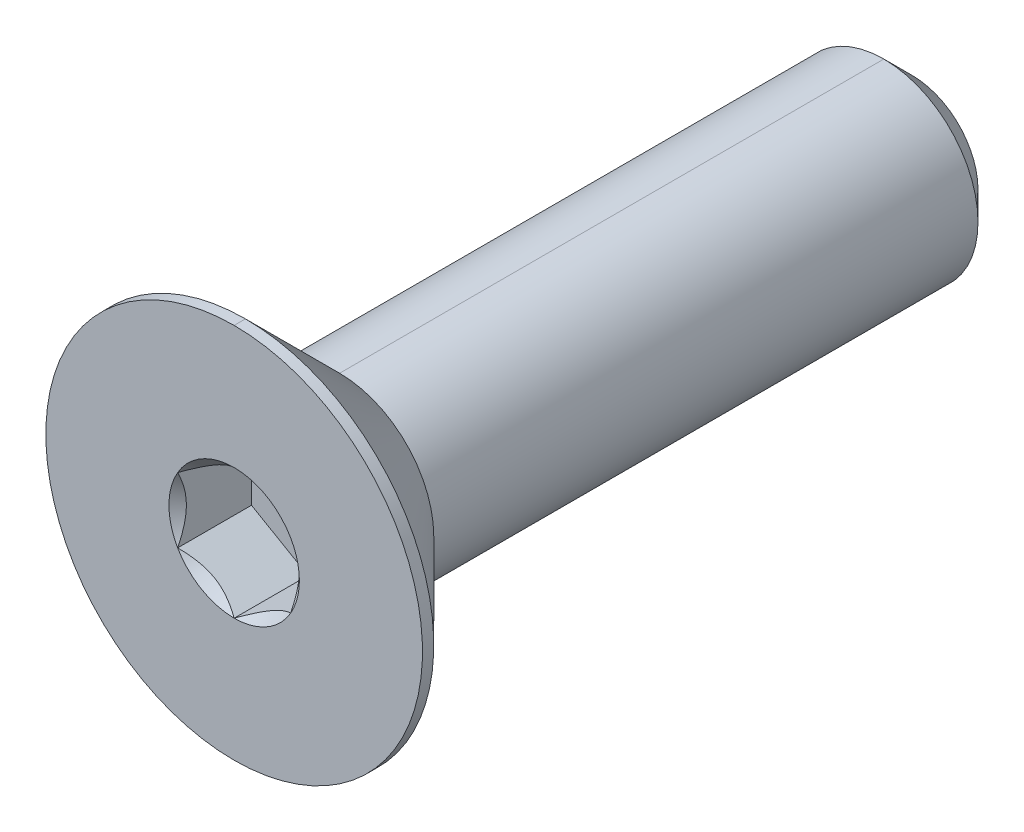
ISO-10303-21;
HEADER;
FILE_DESCRIPTION(('STEP AP214'),'2;1');
FILE_NAME('part.step','',(''),(''),'','','');
FILE_SCHEMA(('AUTOMOTIVE_DESIGN { 1 0 10303 214 1 1 1 1 }'));
ENDSEC;
DATA;
#1=APPLICATION_CONTEXT('core data for automotive mechanical design processes');
#2=APPLICATION_PROTOCOL_DEFINITION('international standard','automotive_design',2000,#1);
#3=PRODUCT_CONTEXT('',#1,'mechanical');
#4=PRODUCT('Part','Part','',(#3));
#5=PRODUCT_RELATED_PRODUCT_CATEGORY('part','',(#4));
#6=PRODUCT_DEFINITION_FORMATION('','',#4);
#7=PRODUCT_DEFINITION_CONTEXT('part definition',#1,'design');
#8=PRODUCT_DEFINITION('design','',#6,#7);
#9=PRODUCT_DEFINITION_SHAPE('','',#8);
#10=(LENGTH_UNIT() NAMED_UNIT(*) SI_UNIT(.MILLI.,.METRE.));
#11=(NAMED_UNIT(*) PLANE_ANGLE_UNIT() SI_UNIT($,.RADIAN.));
#12=(NAMED_UNIT(*) SI_UNIT($,.STERADIAN.) SOLID_ANGLE_UNIT());
#13=UNCERTAINTY_MEASURE_WITH_UNIT(LENGTH_MEASURE(1.E-05),#10,'distance_accuracy_value','');
#14=(GEOMETRIC_REPRESENTATION_CONTEXT(3) GLOBAL_UNCERTAINTY_ASSIGNED_CONTEXT((#13)) GLOBAL_UNIT_ASSIGNED_CONTEXT((#10,
#11,#12)) REPRESENTATION_CONTEXT('',''));
#15=CARTESIAN_POINT('',(0.,0.,0.));
#16=DIRECTION('',(0.,0.,1.));
#17=DIRECTION('',(1.,0.,0.));
#18=AXIS2_PLACEMENT_3D('',#15,#16,#17);
#19=CARTESIAN_POINT('',(0.,0.,9.));
#20=DIRECTION('',(0.,0.,1.));
#21=DIRECTION('',(1.,0.,0.));
#22=AXIS2_PLACEMENT_3D('',#19,#20,#21);
#23=CONICAL_SURFACE('',#22,1.73205080756887,0.78539816339745);
#24=CARTESIAN_POINT('',(0.,1.73205080756888,9.));
#25=CARTESIAN_POINT('',(0.0304755061116495,1.71445405344315,8.98240817434612));
#26=CARTESIAN_POINT('',(0.0612309553783832,1.69668979031318,8.96544336172686));
#27=CARTESIAN_POINT('',(0.122223404849649,1.66146148560235,8.9336134328772));
#28=CARTESIAN_POINT('',(0.152439557180836,1.64400945824889,8.91869489506414));
#29=CARTESIAN_POINT('',(0.212498448213601,1.60933272806347,8.89094966665708));
#30=CARTESIAN_POINT('',(0.242323290897872,1.59211799695153,8.87807213097908));
#31=CARTESIAN_POINT('',(0.301755621301267,1.55782439278804,8.85441165270532));
#32=CARTESIAN_POINT('',(0.331349516352911,1.54075310216759,8.84358395838557));
#33=CARTESIAN_POINT('',(0.377432377824598,1.51413628951098,8.82831451163822));
#34=CARTESIAN_POINT('',(0.393764037702862,1.50469688764808,8.82320709787128));
#35=CARTESIAN_POINT('',(0.426275986645927,1.48589492401473,8.81367579608939));
#36=CARTESIAN_POINT('',(0.442454106519574,1.47653379763414,8.80924173567327));
#37=CARTESIAN_POINT('',(0.474702535138814,1.45787786495759,8.80105871198228));
#38=CARTESIAN_POINT('',(0.490771147191658,1.4485839848936,8.79730096963769));
#39=CARTESIAN_POINT('',(0.522841661720542,1.4300450175165,8.79046828735147));
#40=CARTESIAN_POINT('',(0.538842403074621,1.4208004912597,8.7873863957173));
#41=CARTESIAN_POINT('',(0.570818086297726,1.40233941442039,8.78190370645799));
#42=CARTESIAN_POINT('',(0.586792369672559,1.39312314924559,8.7794981190257));
#43=CARTESIAN_POINT('',(0.618754808071478,1.37469319456542,8.77536553669029));
#44=CARTESIAN_POINT('',(0.634742719251687,1.36547960875135,8.77363619824576));
#45=CARTESIAN_POINT('',(0.66677130632234,1.34702613950009,8.77085424819795));
#46=CARTESIAN_POINT('',(0.682812001750678,1.33778624655028,8.76980192452819));
#47=CARTESIAN_POINT('',(0.714981879056066,1.31924441598487,8.76836887771224));
#48=CARTESIAN_POINT('',(0.731111139208447,1.30994238444656,8.76799113664691));
#49=CARTESIAN_POINT('',(0.763265778927167,1.29138030742534,8.76791426620296));
#50=CARTESIAN_POINT('',(0.779291197474868,1.28212034772763,8.76821105152241));
#51=CARTESIAN_POINT('',(0.811279823381253,1.26364230939171,8.76949073732336));
#52=CARTESIAN_POINT('',(0.827243080276223,1.25442418573263,8.77047173947734));
#53=CARTESIAN_POINT('',(0.859152662699485,1.23600879051723,8.77311462962399));
#54=CARTESIAN_POINT('',(0.875098939820273,1.22681156120121,8.77477739434542));
#55=CARTESIAN_POINT('',(0.907018811581781,1.20841577607493,8.77878164980129));
#56=CARTESIAN_POINT('',(0.922992105001491,1.19921747027645,8.78112668207258));
#57=CARTESIAN_POINT('',(0.955007121517731,1.1807933347439,8.78649274846579));
#58=CARTESIAN_POINT('',(0.971048136325059,1.17156802144486,8.78951976345473));
#59=CARTESIAN_POINT('',(1.00323676403784,1.1530604253202,8.79624718072961));
#60=CARTESIAN_POINT('',(1.01938312421892,1.1437789182885,8.79995568486288));
#61=CARTESIAN_POINT('',(1.05181812480565,1.12512812234856,8.80804518640825));
#62=CARTESIAN_POINT('',(1.0681048691028,1.11575982686234,8.81243605190959));
#63=CARTESIAN_POINT('',(1.10085090156266,1.09689691475906,8.82188432956243));
#64=CARTESIAN_POINT('',(1.11730753786702,1.0874033060841,8.82695287744186));
#65=CARTESIAN_POINT('',(1.16404791243579,1.06040232400226,8.84222055822837));
#66=CARTESIAN_POINT('',(1.19415102449094,1.04296750338085,8.85310787590376));
#67=CARTESIAN_POINT('',(1.2545390921125,1.00799282718252,8.87692903743632));
#68=CARTESIAN_POINT('',(1.28481141481348,0.990460294906088,8.8899053103512));
#69=CARTESIAN_POINT('',(1.3457152893563,0.955203838573414,8.91788528894892));
#70=CARTESIAN_POINT('',(1.37632989241537,0.937490235825286,8.93293854667534));
#71=CARTESIAN_POINT('',(1.4380724117721,0.901790289660898,8.9650740876172));
#72=CARTESIAN_POINT('',(1.46918010443147,0.883816506960307,8.9822093516128));
#73=CARTESIAN_POINT('',(1.5,0.866025403784444,9.));
#74=B_SPLINE_CURVE_WITH_KNOTS('',3,(#24,#25,#26,#27,#28,#29,#30,#31,#32,#33,#34,#35,#36,#37,#38,
#39,#40,#41,#42,#43,#44,#45,#46,#47,#48,#49,#50,#51,#52,#53,#54,#55,#56,#57,#58,#59,#60,#61,#62,
#63,#64,#65,#66,#67,#68,#69,#70,#71,#72,#73),.UNSPECIFIED.,.F.,.F.,(4,2,2,2,2,2,2,2,2,2,2,2,2,2,
2,2,2,2,2,2,2,2,2,2,4),(0.,0.118039663714003,0.231854143020199,0.342107623798448,
0.449571592121338,0.508191019061397,0.565810636617404,0.622617741886474,0.678809844962724,
0.7345933307162,0.790181748253832,0.845793791873537,0.901651072914145,0.957170953773542,
1.01253740691627,1.06797528429429,1.12370622740329,1.17994638524861,1.23690438230184,
1.29477963264379,1.35376105667037,1.46305838518519,1.57494903784592,1.69023306306883,
1.80960022802586),.UNSPECIFIED.);
#75=CARTESIAN_POINT('',(0.,1.73205080756888,9.));
#76=VERTEX_POINT('',#75);
#77=CARTESIAN_POINT('',(1.5,0.866025403784445,9.));
#78=VERTEX_POINT('',#77);
#79=EDGE_CURVE('E310',#76,#78,#74,.T.);
#80=ORIENTED_EDGE('',*,*,#79,.T.);
#81=CARTESIAN_POINT('',(0.,0.,9.));
#82=DIRECTION('',(0.,0.,1.));
#83=DIRECTION('',(1.,0.,0.));
#84=AXIS2_PLACEMENT_3D('',#81,#82,#83);
#85=CIRCLE('',#84,1.73205080756887);
#86=EDGE_CURVE('E155',#78,#76,#85,.T.);
#87=ORIENTED_EDGE('',*,*,#86,.T.);
#88=EDGE_LOOP('',(#80,#87));
#89=FACE_BOUND('',#88,.T.);
#90=ADVANCED_FACE('F16',(#89),#23,.F.);
#91=CARTESIAN_POINT('',(0.,0.,9.));
#92=DIRECTION('',(0.,0.,1.));
#93=DIRECTION('',(1.,0.,0.));
#94=AXIS2_PLACEMENT_3D('',#91,#92,#93);
#95=CONICAL_SURFACE('',#94,1.73205080756887,0.78539816339745);
#96=CARTESIAN_POINT('',(-1.5,-0.866025403784427,9.));
#97=CARTESIAN_POINT('',(-1.49999847155042,-0.830563239060232,8.98227267797866));
#98=CARTESIAN_POINT('',(-1.49999144846271,-0.794769818314377,8.96518162548565));
#99=CARTESIAN_POINT('',(-1.49997812287993,-0.723792778913651,8.93313385914066));
#100=CARTESIAN_POINT('',(-1.49997180352168,-0.688633814532978,8.91812235896397));
#101=CARTESIAN_POINT('',(-1.49996990419214,-0.618759366688804,8.89022557424516));
#102=CARTESIAN_POINT('',(-1.49997399200523,-0.584064833529213,8.87728818678176));
#103=CARTESIAN_POINT('',(-1.49999198314124,-0.514933499326287,8.85354250716544));
#104=CARTESIAN_POINT('',(-1.50000563443526,-0.480512547070614,8.84268847127564));
#105=CARTESIAN_POINT('',(-1.49999694849468,-0.427029905923123,8.82744296048106));
#106=CARTESIAN_POINT('',(-1.4999882402842,-0.408160726019241,8.82236987715932));
#107=CARTESIAN_POINT('',(-1.49996134676691,-0.370592501344601,8.81290812530967));
#108=CARTESIAN_POINT('',(-1.49994332551577,-0.351896038168047,8.80850926542317));
#109=CARTESIAN_POINT('',(-1.49991071272959,-0.314630066948124,8.80039761805684));
#110=CARTESIAN_POINT('',(-1.49989607649713,-0.296062475104422,8.79667604664695));
#111=CARTESIAN_POINT('',(-1.49987569653432,-0.259009711802849,8.78991664991825));
#112=CARTESIAN_POINT('',(-1.49986985863054,-0.240525810048958,8.78687188537265));
#113=CARTESIAN_POINT('',(-1.499869545084,-0.203594417631662,8.78146433876417));
#114=CARTESIAN_POINT('',(-1.49987498780784,-0.185147625618623,8.77909679704042));
#115=CARTESIAN_POINT('',(-1.49989529319158,-0.148243233932046,8.77504133972275));
#116=CARTESIAN_POINT('',(-1.49991012355422,-0.12978588723405,8.77335112627764));
#117=CARTESIAN_POINT('',(-1.49994307195869,-0.09281212113247,8.77064783334563));
#118=CARTESIAN_POINT('',(-1.49996119168192,-0.0742956762975891,8.76963510140946));
#119=CARTESIAN_POINT('',(-1.4999899206611,-0.037154751298292,8.76828391417117));
#120=CARTESIAN_POINT('',(-1.50000049569724,-0.0185301603598793,8.76794851858871));
#121=CARTESIAN_POINT('',(-1.49999950449802,0.0187116662846115,8.76794987195051));
#122=CARTESIAN_POINT('',(-1.49998794698299,0.037328901998005,8.76828635617338));
#123=CARTESIAN_POINT('',(-1.49995818834662,0.0744571248470478,8.76964016380417));
#124=CARTESIAN_POINT('',(-1.49994001652738,0.0929682203476789,8.77065450056816));
#125=CARTESIAN_POINT('',(-1.49990736654743,0.129933330312027,8.77336113981796));
#126=CARTESIAN_POINT('',(-1.49989288692022,0.148387364553618,8.77505317244332));
#127=CARTESIAN_POINT('',(-1.49987353578372,0.185287204915863,8.77911248103033));
#128=CARTESIAN_POINT('',(-1.49986869857504,0.203732749126027,8.78148213341868));
#129=CARTESIAN_POINT('',(-1.49987023406792,0.240663748003625,8.78689409840748));
#130=CARTESIAN_POINT('',(-1.49987668978362,0.259148492140854,8.78994124739667));
#131=CARTESIAN_POINT('',(-1.49989807315694,0.296205076049326,8.79670559870344));
#132=CARTESIAN_POINT('',(-1.49991309335925,0.314775632054697,8.80042981263665));
#133=CARTESIAN_POINT('',(-1.49994609817511,0.352049671943595,8.80854701036074));
#134=CARTESIAN_POINT('',(-1.49996412233174,0.370751223934245,8.81294884556339));
#135=CARTESIAN_POINT('',(-1.4999900870056,0.408331871722514,8.82241653008241));
#136=CARTESIAN_POINT('',(-1.4999978460813,0.427208371273022,8.82749262577144));
#137=CARTESIAN_POINT('',(-1.50000397313625,0.480677103164354,8.84273755024362));
#138=CARTESIAN_POINT('',(-1.49998887427707,0.515077173012235,8.85358664366741));
#139=CARTESIAN_POINT('',(-1.49996977091219,0.584170270459098,8.87732286491198));
#140=CARTESIAN_POINT('',(-1.4999660672554,0.618847383789014,8.89025591878164));
#141=CARTESIAN_POINT('',(-1.49996912635196,0.688690754940299,8.91814395738562));
#142=CARTESIAN_POINT('',(-1.49997623485142,0.723836005199007,8.93315117889313));
#143=CARTESIAN_POINT('',(-1.49999089575749,0.794789403575432,8.96519049529969));
#144=CARTESIAN_POINT('',(-1.49999845480796,0.830572848246732,8.98227748230005));
#145=CARTESIAN_POINT('',(-1.5,0.866025403784438,9.));
#146=B_SPLINE_CURVE_WITH_KNOTS('',3,(#96,#97,#98,#99,#100,#101,#102,#103,#104,#105,#106,#107,
#108,#109,#110,#111,#112,#113,#114,#115,#116,#117,#118,#119,#120,#121,#122,#123,#124,#125,#126,
#127,#128,#129,#130,#131,#132,#133,#134,#135,#136,#137,#138,#139,#140,#141,#142,#143,#144,#145),
.UNSPECIFIED.,.F.,.F.,(4,2,2,2,2,2,2,2,2,2,2,2,2,2,2,2,2,2,2,2,2,2,2,2,4),(0.,0.118949666093114,
0.23360393704888,0.344644433065874,0.452863640325714,0.511473149776386,0.569083728709154,
0.625883551472879,0.682070985391223,0.737853233369471,0.793444603350177,0.849064470101596,
0.904935030502023,0.960783582182657,1.01638767132517,1.07196964073668,1.12774897949595,
1.18394007632196,1.24075018233933,1.29837768404936,1.3570107513648,1.46516579795423,
1.57615279944772,1.69076424836394,1.8096816972802),.UNSPECIFIED.);
#147=CARTESIAN_POINT('',(-1.5,-0.866025403784429,9.));
#148=VERTEX_POINT('',#147);
#149=CARTESIAN_POINT('',(-1.5,0.866025403784437,9.));
#150=VERTEX_POINT('',#149);
#151=EDGE_CURVE('E199',#148,#150,#146,.T.);
#152=ORIENTED_EDGE('',*,*,#151,.T.);
#153=CARTESIAN_POINT('',(0.,0.,9.));
#154=DIRECTION('',(0.,0.,1.));
#155=DIRECTION('',(1.,0.,0.));
#156=AXIS2_PLACEMENT_3D('',#153,#154,#155);
#157=CIRCLE('',#156,1.73205080756887);
#158=EDGE_CURVE('E368',#150,#148,#157,.T.);
#159=ORIENTED_EDGE('',*,*,#158,.T.);
#160=EDGE_LOOP('',(#152,#159));
#161=FACE_BOUND('',#160,.T.);
#162=ADVANCED_FACE('F179',(#161),#95,.F.);
#163=CARTESIAN_POINT('',(0.,0.,9.));
#164=DIRECTION('',(0.,0.,1.));
#165=DIRECTION('',(1.,0.,0.));
#166=AXIS2_PLACEMENT_3D('',#163,#164,#165);
#167=CONICAL_SURFACE('',#166,1.73205080756887,0.78539816339745);
#168=CARTESIAN_POINT('',(1.49999999999999,-0.866025403784441,9.));
#169=CARTESIAN_POINT('',(1.46952301084714,-0.883619589207439,8.98240817434612));
#170=CARTESIAN_POINT('',(1.43876098306373,-0.901372458012252,8.96544336172688));
#171=CARTESIAN_POINT('',(1.37775615151627,-0.936579316337994,8.93361343287722));
#172=CARTESIAN_POINT('',(1.34753417631503,-0.954021258184689,8.91869489506416));
#173=CARTESIAN_POINT('',(1.2874738015379,-0.988695418449477,8.89094966665711));
#174=CARTESIAN_POINT('',(1.2576529857335,-1.00591712432196,8.8780721309791));
#175=CARTESIAN_POINT('',(1.19823768813889,-1.04024023017567,8.85441165270534));
#176=CARTESIAN_POINT('',(1.16865656926037,-1.05733364977711,8.8435839583856));
#177=CARTESIAN_POINT('',(1.12256430259592,-1.08393417216246,8.82831451163816));
#178=CARTESIAN_POINT('',(1.10622371084679,-1.09335810357166,8.82320709787116));
#179=CARTESIAN_POINT('',(1.07368475822741,-1.11211329546638,8.81367579608916));
#180=CARTESIAN_POINT('',(1.05748872503681,-1.12144339507219,8.80924173567299));
#181=CARTESIAN_POINT('',(1.02520799909777,-1.14004338715039,8.80105871198192));
#182=CARTESIAN_POINT('',(1.00912495683612,-1.14931227335973,8.7973009696373));
#183=CARTESIAN_POINT('',(0.977034482863052,-1.16781666996565,8.79046828735104));
#184=CARTESIAN_POINT('',(0.961028117601635,-1.17705145532926,8.78738639571686));
#185=CARTESIAN_POINT('',(0.929052514466016,-1.19551267088414,8.78190370645756));
#186=CARTESIAN_POINT('',(0.913083853009237,-1.20473867350657,8.77949811902527));
#187=CARTESIAN_POINT('',(0.881141824866257,-1.22320397978677,8.7753655366899));
#188=CARTESIAN_POINT('',(0.865168669901308,-1.2324431241152,8.7736361982454));
#189=CARTESIAN_POINT('',(0.833173203206664,-1.25095395953998,8.77085424819766));
#190=CARTESIAN_POINT('',(0.817150873469853,-1.26022566280033,8.76980192452795));
#191=CARTESIAN_POINT('',(0.785008238515198,-1.27881467850062,8.76836887771212));
#192=CARTESIAN_POINT('',(0.768887812820243,-1.28813201176763,8.76799113664687));
#193=CARTESIAN_POINT('',(0.736735262713195,-1.30669770810329,8.76791426620304));
#194=CARTESIAN_POINT('',(0.720703193102583,-1.31594614782338,8.76821105152255));
#195=CARTESIAN_POINT('',(0.688706429537459,-1.33441009132308,8.76949073732362));
#196=CARTESIAN_POINT('',(0.672741671825588,-1.34362561549193,8.77047173947764));
#197=CARTESIAN_POINT('',(0.64083868053602,-1.36205242688724,8.77311462962437));
#198=CARTESIAN_POINT('',(0.624900507743257,-1.37126369331172,8.77477739434582));
#199=CARTESIAN_POINT('',(0.59300935462021,-1.38970922057968,8.77878164980173));
#200=CARTESIAN_POINT('',(0.577056741416981,-1.39894334556401,8.78112668207302));
#201=CARTESIAN_POINT('',(0.545093463744842,-1.41745709540329,8.78649274846623));
#202=CARTESIAN_POINT('',(0.529083600666389,-1.42673636507932,8.78951976345516));
#203=CARTESIAN_POINT('',(0.496961238403333,-1.44535873632897,8.79624718073));
#204=CARTESIAN_POINT('',(0.480850037438167,-1.45470114090844,8.79995568486324));
#205=CARTESIAN_POINT('',(0.448480474060641,-1.47346527741798,8.80804518640853));
#206=CARTESIAN_POINT('',(0.432223920031239,-1.48288586398094,8.81243605190982));
#207=CARTESIAN_POINT('',(0.399515142731546,-1.50181330391224,8.82188432956258));
#208=CARTESIAN_POINT('',(0.383065118293888,-1.51131836467497,8.82695287744195));
#209=CARTESIAN_POINT('',(0.336311394599615,-1.5382962253933,8.84222055822877));
#210=CARTESIAN_POINT('',(0.306160841002967,-1.55564887485581,8.85310787590456));
#211=CARTESIAN_POINT('',(0.245677849114556,-1.59045913740294,8.87692903743764));
#212=CARTESIAN_POINT('',(0.21535806941975,-1.60790947175543,8.88990531035262));
#213=CARTESIAN_POINT('',(0.154373145316718,-1.64302554613198,8.91788528895032));
#214=CARTESIAN_POINT('',(0.123725413814895,-1.66068176873365,8.9329385466766));
#215=CARTESIAN_POINT('',(0.061937093845168,-1.69630238590742,8.96507408761796));
#216=CARTESIAN_POINT('',(0.0308174950952595,-1.71425554665284,8.98220935161317));
#217=CARTESIAN_POINT('',(0.,-1.73205080756887,9.));
#218=B_SPLINE_CURVE_WITH_KNOTS('',3,(#168,#169,#170,#171,#172,#173,#174,#175,#176,#177,#178,
#179,#180,#181,#182,#183,#184,#185,#186,#187,#188,#189,#190,#191,#192,#193,#194,#195,#196,#197,
#198,#199,#200,#201,#202,#203,#204,#205,#206,#207,#208,#209,#210,#211,#212,#213,#214,#215,#216,
#217),.UNSPECIFIED.,.F.,.F.,(4,2,2,2,2,2,2,2,2,2,2,2,2,2,2,2,2,2,2,2,2,2,2,2,4),(0.,
0.118039663713976,0.231854143020164,0.342107623798421,0.449571592121331,0.508191019062084,
0.565810636618574,0.622617741887922,0.678809844964254,0.734593330717623,0.790181748254961,
0.845793791874205,0.901651072914188,0.957170953775485,1.01253740691958,1.06797528429843,
1.12370622740773,1.17994638525279,1.23690438230521,1.29477963264579,1.35376105667045,
1.46305838518758,1.57494903784916,1.69023306307132,1.80960022802589),.UNSPECIFIED.);
#219=CARTESIAN_POINT('',(1.5,-0.866025403784445,9.));
#220=VERTEX_POINT('',#219);
#221=CARTESIAN_POINT('',(0.,-1.73205080756887,9.));
#222=VERTEX_POINT('',#221);
#223=EDGE_CURVE('E114',#220,#222,#218,.T.);
#224=ORIENTED_EDGE('',*,*,#223,.T.);
#225=CARTESIAN_POINT('',(0.,0.,9.));
#226=DIRECTION('',(0.,0.,1.));
#227=DIRECTION('',(1.,0.,0.));
#228=AXIS2_PLACEMENT_3D('',#225,#226,#227);
#229=CIRCLE('',#228,1.73205080756887);
#230=EDGE_CURVE('E154',#222,#220,#229,.T.);
#231=ORIENTED_EDGE('',*,*,#230,.T.);
#232=EDGE_LOOP('',(#224,#231));
#233=FACE_BOUND('',#232,.T.);
#234=ADVANCED_FACE('F176',(#233),#167,.F.);
#235=CARTESIAN_POINT('',(0.,0.,9.));
#236=DIRECTION('',(0.,0.,1.));
#237=DIRECTION('',(1.,0.,0.));
#238=AXIS2_PLACEMENT_3D('',#235,#236,#237);
#239=CONICAL_SURFACE('',#238,1.73205080756887,0.78539816339745);
#240=DIRECTION('',(0.707106781186549,0.,0.707106781186546));
#241=VECTOR('',#240,1.);
#242=CARTESIAN_POINT('',(1.73205080756887,0.,9.));
#243=LINE('',#242,#241);
#244=CARTESIAN_POINT('',(1.5,0.,8.76794919243112));
#245=VERTEX_POINT('',#244);
#246=CARTESIAN_POINT('',(1.73205080756887,0.,9.));
#247=VERTEX_POINT('',#246);
#248=EDGE_CURVE('E286',#245,#247,#243,.T.);
#249=ORIENTED_EDGE('',*,*,#248,.F.);
#250=CARTESIAN_POINT('',(1.5,0.,8.76794919243112));
#251=CARTESIAN_POINT('',(1.49999924407982,-0.0186171664357351,8.7679472591936));
#252=CARTESIAN_POINT('',(1.49998880432645,-0.0372345453023492,8.76828455326528));
#253=CARTESIAN_POINT('',(1.49996019835754,-0.0743624293453901,8.76963779692583));
#254=CARTESIAN_POINT('',(1.49994206639419,-0.0928730439419721,8.77065074922434));
#255=CARTESIAN_POINT('',(1.49990951398124,-0.129836679597664,8.77335486866681));
#256=CARTESIAN_POINT('',(1.49989509193842,-0.148289722006334,8.77504574387783));
#257=CARTESIAN_POINT('',(1.49987565786334,-0.185186997641661,8.77910234406569));
#258=CARTESIAN_POINT('',(1.49987067909907,-0.203630971714245,8.78147042119714));
#259=CARTESIAN_POINT('',(1.49987186861001,-0.240558230397227,8.78687901543369));
#260=CARTESIAN_POINT('',(1.49987811903853,-0.259040808508445,8.7899243444073));
#261=CARTESIAN_POINT('',(1.49989907625501,-0.296092428889916,8.79668479251259));
#262=CARTESIAN_POINT('',(1.49991387513417,-0.314660192502451,8.80040689835464));
#263=CARTESIAN_POINT('',(1.49994648092928,-0.351927993717902,8.80851961818359));
#264=CARTESIAN_POINT('',(1.49996432796618,-0.370626105461714,8.81291905945674));
#265=CARTESIAN_POINT('',(1.49999009572025,-0.408199182074071,8.82238173103812));
#266=CARTESIAN_POINT('',(1.49999783818098,-0.427071557073628,8.82745518584201));
#267=CARTESIAN_POINT('',(1.50000398994056,-0.480548073490088,8.84269792906382));
#268=CARTESIAN_POINT('',(1.49998897004706,-0.514959851432077,8.85354839366671));
#269=CARTESIAN_POINT('',(1.49996991502432,-0.584076274585653,8.87728864223531));
#270=CARTESIAN_POINT('',(1.4999661778019,-0.618764997492655,8.89022438265426));
#271=CARTESIAN_POINT('',(1.49996918371623,-0.688631688063282,8.91811913176976));
#272=CARTESIAN_POINT('',(1.49997627313474,-0.723788631713074,8.93313042292117));
#273=CARTESIAN_POINT('',(1.49999090702831,-0.794765707582953,8.96517919786526));
#274=CARTESIAN_POINT('',(1.4999984585924,-0.830561114278723,8.98227162506569));
#275=CARTESIAN_POINT('',(1.49999999999999,-0.866025403784441,9.));
#276=B_SPLINE_CURVE_WITH_KNOTS('',3,(#250,#251,#252,#253,#254,#255,#256,#257,#258,#259,#260,
#261,#262,#263,#264,#265,#266,#267,#268,#269,#270,#271,#272,#273,#274,#275),.UNSPECIFIED.,.F.,
.F.,(4,2,2,2,2,2,2,2,2,2,2,2,4),(0.,0.0558486842931357,0.111451251243419,0.167029899814972,
0.222803986879995,0.278987782928246,0.33578843610191,0.393404245362079,0.452023307770853,
0.560213018661399,0.671235422865352,0.785883889608249,0.904840702772341),.UNSPECIFIED.);
#277=EDGE_CURVE('E128',#245,#220,#276,.T.);
#278=ORIENTED_EDGE('',*,*,#277,.T.);
#279=CARTESIAN_POINT('',(0.,0.,9.));
#280=DIRECTION('',(0.,0.,1.));
#281=DIRECTION('',(1.,0.,0.));
#282=AXIS2_PLACEMENT_3D('',#279,#280,#281);
#283=CIRCLE('',#282,1.73205080756887);
#284=EDGE_CURVE('E150',#220,#247,#283,.T.);
#285=ORIENTED_EDGE('',*,*,#284,.T.);
#286=EDGE_LOOP('',(#249,#278,#285));
#287=FACE_BOUND('',#286,.T.);
#288=ADVANCED_FACE('F166',(#287),#239,.F.);
#289=CARTESIAN_POINT('',(0.,0.,9.));
#290=DIRECTION('',(0.,0.,1.));
#291=DIRECTION('',(1.,0.,0.));
#292=AXIS2_PLACEMENT_3D('',#289,#290,#291);
#293=CONICAL_SURFACE('',#292,1.73205080756887,0.78539816339745);
#294=CARTESIAN_POINT('',(0.,-1.73205080756887,9.));
#295=CARTESIAN_POINT('',(-0.0304755061112936,-1.71445405344335,8.98240817434633));
#296=CARTESIAN_POINT('',(-0.061230955377687,-1.69668979031362,8.9654433617273));
#297=CARTESIAN_POINT('',(-0.12222340484853,-1.66146148560315,8.93361343287793));
#298=CARTESIAN_POINT('',(-0.152439557179639,-1.64400945824979,8.91869489506495));
#299=CARTESIAN_POINT('',(-0.212498448212464,-1.60933272806443,8.8909496666579));
#300=CARTESIAN_POINT('',(-0.24232329089688,-1.59211799695244,8.87807213097984));
#301=CARTESIAN_POINT('',(-0.301755621300701,-1.55782439278862,8.85441165270578));
#302=CARTESIAN_POINT('',(-0.331349516352634,-1.54075310216789,8.84358395838581));
#303=CARTESIAN_POINT('',(-0.377432377824228,-1.51413628951112,8.82831451163828));
#304=CARTESIAN_POINT('',(-0.393764037702108,-1.50469688764836,8.82320709787139));
#305=CARTESIAN_POINT('',(-0.42627598664454,-1.4858949240153,8.81367579608957));
#306=CARTESIAN_POINT('',(-0.442454106517938,-1.47653379763484,8.80924173567348));
#307=CARTESIAN_POINT('',(-0.474702535136791,-1.45787786495852,8.80105871198255));
#308=CARTESIAN_POINT('',(-0.490771147189497,-1.44858398489462,8.79730096963798));
#309=CARTESIAN_POINT('',(-0.522841661718213,-1.43004501751768,8.79046828735179));
#310=CARTESIAN_POINT('',(-0.538842403072263,-1.42080049126093,8.78738639571763));
#311=CARTESIAN_POINT('',(-0.570818086295408,-1.40233941442167,8.78190370645832));
#312=CARTESIAN_POINT('',(-0.586792369670311,-1.39312314924688,8.77949811902602));
#313=CARTESIAN_POINT('',(-0.618754808069462,-1.37469319456664,8.77536553669059));
#314=CARTESIAN_POINT('',(-0.634742719249833,-1.36547960875251,8.77363619824604));
#315=CARTESIAN_POINT('',(-0.666771306320895,-1.34702613950105,8.77085424819817));
#316=CARTESIAN_POINT('',(-0.68281200174948,-1.3377862465511,8.76980192452839));
#317=CARTESIAN_POINT('',(-0.714981879055439,-1.31924441598532,8.76836887771236));
#318=CARTESIAN_POINT('',(-0.731111139208142,-1.30994238444679,8.76799113664698));
#319=CARTESIAN_POINT('',(-0.763265778927456,-1.29138030742512,8.76791426620293));
#320=CARTESIAN_POINT('',(-0.779291197475429,-1.28212034772717,8.76821105152232));
#321=CARTESIAN_POINT('',(-0.811279823382267,-1.26364230939084,8.76949073732319));
#322=CARTESIAN_POINT('',(-0.827243080277417,-1.25442418573159,8.77047173947714));
#323=CARTESIAN_POINT('',(-0.859152662700957,-1.23600879051588,8.77311462962374));
#324=CARTESIAN_POINT('',(-0.875098939821842,-1.22681156119973,8.77477739434514));
#325=CARTESIAN_POINT('',(-0.907018811583464,-1.20841577607326,8.77878164980099));
#326=CARTESIAN_POINT('',(-0.922992105003192,-1.19921747027472,8.78112668207227));
#327=CARTESIAN_POINT('',(-0.955007121519396,-1.18079333474213,8.78649274846547));
#328=CARTESIAN_POINT('',(-0.971048136326671,-1.1715680214431,8.78951976345442));
#329=CARTESIAN_POINT('',(-1.00323676403928,-1.15306042531855,8.79624718072933));
#330=CARTESIAN_POINT('',(-1.01938312422024,-1.14377891828695,8.79995568486262));
#331=CARTESIAN_POINT('',(-1.05181812480668,-1.12512812234729,8.80804518640804));
#332=CARTESIAN_POINT('',(-1.06810486910365,-1.11575982686125,8.8124360519094));
#333=CARTESIAN_POINT('',(-1.10085090156311,-1.09689691475846,8.82188432956234));
#334=CARTESIAN_POINT('',(-1.11730753786725,-1.08740330608381,8.82695287744183));
#335=CARTESIAN_POINT('',(-1.16404791243664,-1.06040232400207,8.84222055822886));
#336=CARTESIAN_POINT('',(-1.1941510244926,-1.04296750338042,8.85310787590472));
#337=CARTESIAN_POINT('',(-1.2545390921152,-1.00799282718165,8.8769290374379));
#338=CARTESIAN_POINT('',(-1.28481141481644,-0.990460294905019,8.8899053103529));
#339=CARTESIAN_POINT('',(-1.34571528935922,-0.955203838572175,8.9178852889506));
#340=CARTESIAN_POINT('',(-1.37632989241801,-0.937490235824074,8.93293854667685));
#341=CARTESIAN_POINT('',(-1.43807241177366,-0.90179028966008,8.96507408761811));
#342=CARTESIAN_POINT('',(-1.46918010443224,-0.883816506959852,8.98220935161324));
#343=CARTESIAN_POINT('',(-1.5,-0.866025403784427,9.));
#344=B_SPLINE_CURVE_WITH_KNOTS('',3,(#294,#295,#296,#297,#298,#299,#300,#301,#302,#303,#304,
#305,#306,#307,#308,#309,#310,#311,#312,#313,#314,#315,#316,#317,#318,#319,#320,#321,#322,#323,
#324,#325,#326,#327,#328,#329,#330,#331,#332,#333,#334,#335,#336,#337,#338,#339,#340,#341,#342,
#343),.UNSPECIFIED.,.F.,.F.,(4,2,2,2,2,2,2,2,2,2,2,2,2,2,2,2,2,2,2,2,2,2,2,2,4),(0.,
0.118039663712588,0.231854143018354,0.342107623797091,0.449571592121306,0.508191019060165,
0.565810636615319,0.622617741883885,0.678809844959973,0.734593330713632,0.790181748251784,
0.845793791872343,0.901651072914128,0.957170953774576,1.01253740691804,1.06797528429648,
1.12370622740562,1.17994638525079,1.23690438230359,1.29477963264484,1.35376105667047,
1.46305838518806,1.57494903784981,1.69023306307182,1.8096002280259),.UNSPECIFIED.);
#345=EDGE_CURVE('E435',#222,#148,#344,.T.);
#346=ORIENTED_EDGE('',*,*,#345,.T.);
#347=CARTESIAN_POINT('',(0.,0.,9.));
#348=DIRECTION('',(0.,0.,1.));
#349=DIRECTION('',(1.,0.,0.));
#350=AXIS2_PLACEMENT_3D('',#347,#348,#349);
#351=CIRCLE('',#350,1.73205080756887);
#352=EDGE_CURVE('E243',#148,#222,#351,.T.);
#353=ORIENTED_EDGE('',*,*,#352,.T.);
#354=EDGE_LOOP('',(#346,#353));
#355=FACE_BOUND('',#354,.T.);
#356=ADVANCED_FACE('F175',(#355),#293,.F.);
#357=CARTESIAN_POINT('',(0.,0.,9.));
#358=DIRECTION('',(0.,0.,1.));
#359=DIRECTION('',(1.,0.,0.));
#360=AXIS2_PLACEMENT_3D('',#357,#358,#359);
#361=CONICAL_SURFACE('',#360,1.73205080756887,0.78539816339745);
#362=CARTESIAN_POINT('',(-1.5,0.866025403784438,9.));
#363=CARTESIAN_POINT('',(-1.46952301084669,0.8836195892077,8.98240817434586));
#364=CARTESIAN_POINT('',(-1.43876098306279,0.901372458012735,8.96544336172632));
#365=CARTESIAN_POINT('',(-1.37775615151468,0.936579316338719,8.9336134328763));
#366=CARTESIAN_POINT('',(-1.34753417631327,0.954021258185432,8.91869489506315));
#367=CARTESIAN_POINT('',(-1.28747380153612,0.988695418450121,8.89094966665608));
#368=CARTESIAN_POINT('',(-1.25765298573187,1.00591712432249,8.87807213097815));
#369=CARTESIAN_POINT('',(-1.1982376881379,1.04024023017594,8.85441165270476));
#370=CARTESIAN_POINT('',(-1.16865656925986,1.05733364977723,8.8435839583853));
#371=CARTESIAN_POINT('',(-1.12256430259577,1.08393417216265,8.82831451163816));
#372=CARTESIAN_POINT('',(-1.10622371084647,1.09335810357205,8.8232070978712));
#373=CARTESIAN_POINT('',(-1.0736847582268,1.1121132954671,8.81367579608923));
#374=CARTESIAN_POINT('',(-1.05748872503607,1.12144339507302,8.80924173567307));
#375=CARTESIAN_POINT('',(-1.02520799909681,1.1400433871514,8.80105871198202));
#376=CARTESIAN_POINT('',(-1.00912495683508,1.14931227336081,8.79730096963741));
#377=CARTESIAN_POINT('',(-0.97703448286189,1.16781666996679,8.79046828735116));
#378=CARTESIAN_POINT('',(-0.961028117600436,1.17705145533041,8.78738639571698));
#379=CARTESIAN_POINT('',(-0.929052514464795,1.19551267088525,8.78190370645767));
#380=CARTESIAN_POINT('',(-0.913083853008031,1.20473867350764,8.77949811902538));
#381=CARTESIAN_POINT('',(-0.881141824865136,1.22320397978772,8.77536553669001));
#382=CARTESIAN_POINT('',(-0.865168669900257,1.23244312411607,8.77363619824549));
#383=CARTESIAN_POINT('',(-0.833173203205814,1.25095395954065,8.77085424819773));
#384=CARTESIAN_POINT('',(-0.817150873469134,1.26022566280088,8.76980192452801));
#385=CARTESIAN_POINT('',(-0.785008238514806,1.2788146785009,8.76836887771215));
#386=CARTESIAN_POINT('',(-0.768887812820045,1.28813201176777,8.76799113664687));
#387=CARTESIAN_POINT('',(-0.736735262713357,1.30669770810317,8.767914266203));
#388=CARTESIAN_POINT('',(-0.720703193102909,1.31594614782315,8.7682110515225));
#389=CARTESIAN_POINT('',(-0.688706429538072,1.33441009132268,8.76949073732354));
#390=CARTESIAN_POINT('',(-0.672741671826324,1.34362561549147,8.77047173947754));
#391=CARTESIAN_POINT('',(-0.640838680536961,1.36205242688668,8.77311462962425));
#392=CARTESIAN_POINT('',(-0.62490050774428,1.37126369331113,8.77477739434569));
#393=CARTESIAN_POINT('',(-0.593009354621349,1.38970922057907,8.77878164980159));
#394=CARTESIAN_POINT('',(-0.577056741418155,1.3989433455634,8.78112668207288));
#395=CARTESIAN_POINT('',(-0.545093463746035,1.4174570954027,8.78649274846609));
#396=CARTESIAN_POINT('',(-0.529083600667567,1.42673636507875,8.78951976345503));
#397=CARTESIAN_POINT('',(-0.496961238404426,1.44535873632849,8.79624718072988));
#398=CARTESIAN_POINT('',(-0.48085003743919,1.454701140908,8.79995568486313));
#399=CARTESIAN_POINT('',(-0.448480474061469,1.47346527741765,8.80804518640844));
#400=CARTESIAN_POINT('',(-0.432223920031941,1.48288586398067,8.81243605190975));
#401=CARTESIAN_POINT('',(-0.399515142731931,1.50181330391211,8.82188432956252));
#402=CARTESIAN_POINT('',(-0.383065118294079,1.5113183646749,8.82695287744191));
#403=CARTESIAN_POINT('',(-0.336311394599774,1.53829622539313,8.84222055822864));
#404=CARTESIAN_POINT('',(-0.306160841003287,1.55564887485549,8.8531078759043));
#405=CARTESIAN_POINT('',(-0.245677849115112,1.59045913740244,8.87692903743721));
#406=CARTESIAN_POINT('',(-0.215358069420386,1.6079094717549,8.88990531035216));
#407=CARTESIAN_POINT('',(-0.154373145317388,1.64302554613148,8.91788528894987));
#408=CARTESIAN_POINT('',(-0.123725413815524,1.66068176873322,8.93293854667619));
#409=CARTESIAN_POINT('',(-0.0619370938455639,1.69630238590718,8.96507408761772));
#410=CARTESIAN_POINT('',(-0.0308174950954671,1.71425554665274,8.98220935161305));
#411=CARTESIAN_POINT('',(0.,1.73205080756888,9.));
#412=B_SPLINE_CURVE_WITH_KNOTS('',3,(#362,#363,#364,#365,#366,#367,#368,#369,#370,#371,#372,
#373,#374,#375,#376,#377,#378,#379,#380,#381,#382,#383,#384,#385,#386,#387,#388,#389,#390,#391,
#392,#393,#394,#395,#396,#397,#398,#399,#400,#401,#402,#403,#404,#405,#406,#407,#408,#409,#410,
#411),.UNSPECIFIED.,.F.,.F.,(4,2,2,2,2,2,2,2,2,2,2,2,2,2,2,2,2,2,2,2,2,2,2,2,4),(0.,
0.118039663715767,0.231854143022501,0.342107623800138,0.44957159212137,0.5081910190628,
0.565810636619783,0.622617741889434,0.678809844965869,0.734593330719139,0.790181748256177,
0.845793791874906,0.901651072914162,0.957170953774872,1.01253740691855,1.06797528429714,
1.12370622740635,1.17994638525149,1.23690438230416,1.29477963264516,1.35376105667042,
1.46305838518681,1.57494903784812,1.69023306307052,1.80960022802588),.UNSPECIFIED.);
#413=EDGE_CURVE('E29',#150,#76,#412,.T.);
#414=ORIENTED_EDGE('',*,*,#413,.T.);
#415=CARTESIAN_POINT('',(0.,0.,9.));
#416=DIRECTION('',(0.,0.,1.));
#417=DIRECTION('',(1.,0.,0.));
#418=AXIS2_PLACEMENT_3D('',#415,#416,#417);
#419=CIRCLE('',#418,1.73205080756887);
#420=EDGE_CURVE('E364',#76,#150,#419,.T.);
#421=ORIENTED_EDGE('',*,*,#420,.T.);
#422=EDGE_LOOP('',(#414,#421));
#423=FACE_BOUND('',#422,.T.);
#424=ADVANCED_FACE('F442',(#423),#361,.F.);
#425=CARTESIAN_POINT('',(0.,0.,7.04));
#426=DIRECTION('',(0.,0.,1.));
#427=DIRECTION('',(1.,0.,0.));
#428=AXIS2_PLACEMENT_3D('',#425,#426,#427);
#429=PLANE('',#428);
#430=DIRECTION('',(-0.866025403784439,0.5,0.));
#431=VECTOR('',#430,1.);
#432=CARTESIAN_POINT('',(1.5,0.866025403784439,7.04));
#433=LINE('',#432,#431);
#434=CARTESIAN_POINT('',(1.5,0.866025403784439,7.04));
#435=VERTEX_POINT('',#434);
#436=CARTESIAN_POINT('',(0.,1.73205080756887,7.04));
#437=VERTEX_POINT('',#436);
#438=EDGE_CURVE('E135',#435,#437,#433,.T.);
#439=ORIENTED_EDGE('',*,*,#438,.T.);
#440=DIRECTION('',(-0.866025403784439,-0.5,0.));
#441=VECTOR('',#440,1.);
#442=CARTESIAN_POINT('',(0.,1.73205080756887,7.04));
#443=LINE('',#442,#441);
#444=CARTESIAN_POINT('',(-1.5,0.866025403784439,7.04));
#445=VERTEX_POINT('',#444);
#446=EDGE_CURVE('E10',#437,#445,#443,.T.);
#447=ORIENTED_EDGE('',*,*,#446,.T.);
#448=DIRECTION('',(0.,-1.,0.));
#449=VECTOR('',#448,1.);
#450=CARTESIAN_POINT('',(-1.5,0.866025403784439,7.04));
#451=LINE('',#450,#449);
#452=CARTESIAN_POINT('',(-1.5,-0.866025403784439,7.04));
#453=VERTEX_POINT('',#452);
#454=EDGE_CURVE('E436',#445,#453,#451,.T.);
#455=ORIENTED_EDGE('',*,*,#454,.T.);
#456=DIRECTION('',(0.866025403784439,-0.5,0.));
#457=VECTOR('',#456,1.);
#458=CARTESIAN_POINT('',(-1.5,-0.866025403784439,7.04));
#459=LINE('',#458,#457);
#460=CARTESIAN_POINT('',(0.,-1.73205080756887,7.04));
#461=VERTEX_POINT('',#460);
#462=EDGE_CURVE('E107',#453,#461,#459,.T.);
#463=ORIENTED_EDGE('',*,*,#462,.T.);
#464=DIRECTION('',(0.866025403784439,0.5,0.));
#465=VECTOR('',#464,1.);
#466=CARTESIAN_POINT('',(0.,-1.73205080756887,7.04));
#467=LINE('',#466,#465);
#468=CARTESIAN_POINT('',(1.5,-0.866025403784439,7.04));
#469=VERTEX_POINT('',#468);
#470=EDGE_CURVE('E101',#461,#469,#467,.T.);
#471=ORIENTED_EDGE('',*,*,#470,.T.);
#472=DIRECTION('',(0.,1.,0.));
#473=VECTOR('',#472,1.);
#474=CARTESIAN_POINT('',(1.5,-0.866025403784439,7.04));
#475=LINE('',#474,#473);
#476=EDGE_CURVE('E104',#469,#435,#475,.T.);
#477=ORIENTED_EDGE('',*,*,#476,.T.);
#478=EDGE_LOOP('',(#439,#447,#455,#463,#471,#477));
#479=FACE_BOUND('',#478,.T.);
#480=ADVANCED_FACE('F103',(#479),#429,.T.);
#481=CARTESIAN_POINT('',(0.,1.73205080756887,7.04));
#482=DIRECTION('',(-0.5,0.866025403784439,0.));
#483=DIRECTION('',(0.,0.,1.));
#484=AXIS2_PLACEMENT_3D('',#481,#482,#483);
#485=PLANE('',#484);
#486=DIRECTION('',(0.,0.,1.));
#487=VECTOR('',#486,1.);
#488=CARTESIAN_POINT('',(0.,1.73205080756887,7.04));
#489=LINE('',#488,#487);
#490=EDGE_CURVE('E141',#437,#76,#489,.T.);
#491=ORIENTED_EDGE('',*,*,#490,.T.);
#492=ORIENTED_EDGE('',*,*,#413,.F.);
#493=DIRECTION('',(0.,0.,1.));
#494=VECTOR('',#493,1.);
#495=CARTESIAN_POINT('',(-1.5,0.866025403784439,7.04));
#496=LINE('',#495,#494);
#497=EDGE_CURVE('E354',#445,#150,#496,.T.);
#498=ORIENTED_EDGE('',*,*,#497,.F.);
#499=ORIENTED_EDGE('',*,*,#446,.F.);
#500=EDGE_LOOP('',(#491,#492,#498,#499));
#501=FACE_BOUND('',#500,.T.);
#502=ADVANCED_FACE('F217',(#501),#485,.F.);
#503=CARTESIAN_POINT('',(-1.5,0.866025403784439,7.04));
#504=DIRECTION('',(-1.,0.,0.));
#505=DIRECTION('',(0.,0.,1.));
#506=AXIS2_PLACEMENT_3D('',#503,#504,#505);
#507=PLANE('',#506);
#508=ORIENTED_EDGE('',*,*,#497,.T.);
#509=ORIENTED_EDGE('',*,*,#151,.F.);
#510=DIRECTION('',(0.,0.,1.));
#511=VECTOR('',#510,1.);
#512=CARTESIAN_POINT('',(-1.5,-0.866025403784439,7.04));
#513=LINE('',#512,#511);
#514=EDGE_CURVE('E113',#453,#148,#513,.T.);
#515=ORIENTED_EDGE('',*,*,#514,.F.);
#516=ORIENTED_EDGE('',*,*,#454,.F.);
#517=EDGE_LOOP('',(#508,#509,#515,#516));
#518=FACE_BOUND('',#517,.T.);
#519=ADVANCED_FACE('F206',(#518),#507,.F.);
#520=CARTESIAN_POINT('',(-1.5,-0.866025403784439,7.04));
#521=DIRECTION('',(-0.5,-0.866025403784439,0.));
#522=DIRECTION('',(-0.866025403784439,0.5,0.));
#523=AXIS2_PLACEMENT_3D('',#520,#521,#522);
#524=PLANE('',#523);
#525=ORIENTED_EDGE('',*,*,#514,.T.);
#526=ORIENTED_EDGE('',*,*,#345,.F.);
#527=DIRECTION('',(0.,0.,1.));
#528=VECTOR('',#527,1.);
#529=CARTESIAN_POINT('',(0.,-1.73205080756887,7.04));
#530=LINE('',#529,#528);
#531=EDGE_CURVE('E127',#461,#222,#530,.T.);
#532=ORIENTED_EDGE('',*,*,#531,.F.);
#533=ORIENTED_EDGE('',*,*,#462,.F.);
#534=EDGE_LOOP('',(#525,#526,#532,#533));
#535=FACE_BOUND('',#534,.T.);
#536=ADVANCED_FACE('F216',(#535),#524,.F.);
#537=CARTESIAN_POINT('',(0.,-1.73205080756887,7.04));
#538=DIRECTION('',(0.5,-0.866025403784439,0.));
#539=DIRECTION('',(0.,0.,-1.));
#540=AXIS2_PLACEMENT_3D('',#537,#538,#539);
#541=PLANE('',#540);
#542=ORIENTED_EDGE('',*,*,#531,.T.);
#543=ORIENTED_EDGE('',*,*,#223,.F.);
#544=DIRECTION('',(0.,0.,1.));
#545=VECTOR('',#544,1.);
#546=CARTESIAN_POINT('',(1.5,-0.866025403784439,7.04));
#547=LINE('',#546,#545);
#548=EDGE_CURVE('E121',#469,#220,#547,.T.);
#549=ORIENTED_EDGE('',*,*,#548,.F.);
#550=ORIENTED_EDGE('',*,*,#470,.F.);
#551=EDGE_LOOP('',(#542,#543,#549,#550));
#552=FACE_BOUND('',#551,.T.);
#553=ADVANCED_FACE('F130',(#552),#541,.F.);
#554=CARTESIAN_POINT('',(1.5,-0.866025403784439,7.04));
#555=DIRECTION('',(1.,0.,0.));
#556=DIRECTION('',(0.,-1.,0.));
#557=AXIS2_PLACEMENT_3D('',#554,#555,#556);
#558=PLANE('',#557);
#559=ORIENTED_EDGE('',*,*,#548,.T.);
#560=ORIENTED_EDGE('',*,*,#277,.F.);
#561=CARTESIAN_POINT('',(1.5,0.866025403784444,9.));
#562=CARTESIAN_POINT('',(1.49999846778053,0.830574967539238,8.98227853249992));
#563=CARTESIAN_POINT('',(1.49999143738431,0.794793503144022,8.96519291779794));
#564=CARTESIAN_POINT('',(1.49997808524012,0.723840127374209,8.93315460475534));
#565=CARTESIAN_POINT('',(1.4999717470714,0.688692848184721,8.91814717141389));
#566=CARTESIAN_POINT('',(1.49996979497141,0.618841700833322,8.89025709125088));
#567=CARTESIAN_POINT('',(1.49997384936187,0.584158766507746,8.87732238720971));
#568=CARTESIAN_POINT('',(1.49999188844816,0.515050734021091,8.85358072791992));
#569=CARTESIAN_POINT('',(1.50000561820606,0.480641476582164,8.84272805939527));
#570=CARTESIAN_POINT('',(1.49999695558408,0.427166613650031,8.82748036727495));
#571=CARTESIAN_POINT('',(1.4999882298662,0.408293316322745,8.82240464578818));
#572=CARTESIAN_POINT('',(1.49996113777938,0.370717533839255,8.81293788484475));
#573=CARTESIAN_POINT('',(1.49994293861003,0.35201763665695,8.80853663216533));
#574=CARTESIAN_POINT('',(1.49990992752029,0.314745438889466,8.80042051391968));
#575=CARTESIAN_POINT('',(1.49989507143194,0.296175060526002,8.79669684023687));
#576=CARTESIAN_POINT('',(1.49987426110384,0.259117343569228,8.78993353265837));
#577=CARTESIAN_POINT('',(1.49986821230609,0.240631279793158,8.78688693485155));
#578=CARTESIAN_POINT('',(1.49986756885967,0.203696159019127,8.78147606010481));
#579=CARTESIAN_POINT('',(1.49987289152252,0.185247804660954,8.77910699850548));
#580=CARTESIAN_POINT('',(1.49989305662495,0.148340846808672,8.7750486862563));
#581=CARTESIAN_POINT('',(1.49990786609969,0.129882499094726,8.77335711441223));
#582=CARTESIAN_POINT('',(1.49994112828893,0.0929073008971023,8.77065185423615));
#583=CARTESIAN_POINT('',(1.4999595827497,0.0743904265742644,8.76963849185517));
#584=CARTESIAN_POINT('',(1.49998865864194,0.0372490365085602,8.76828467728748));
#585=CARTESIAN_POINT('',(1.49999924463164,0.018624410023222,8.76794725832017));
#586=CARTESIAN_POINT('',(1.5,0.,8.76794919243112));
#587=B_SPLINE_CURVE_WITH_KNOTS('',3,(#561,#562,#563,#564,#565,#566,#567,#568,#569,#570,#571,
#572,#573,#574,#575,#576,#577,#578,#579,#580,#581,#582,#583,#584,#585,#586),.UNSPECIFIED.,.F.,
.F.,(4,2,2,2,2,2,2,2,2,2,2,2,4),(0.,0.118910320263521,0.233527599247868,0.344532726004553,
0.452717310253287,0.511340802227361,0.568963053613363,0.625772311502694,0.681967030658994,
0.737754516867471,0.793349196184119,0.848970575444414,0.904840995198857),.UNSPECIFIED.);
#588=EDGE_CURVE('E278',#78,#245,#587,.T.);
#589=ORIENTED_EDGE('',*,*,#588,.F.);
#590=DIRECTION('',(0.,0.,1.));
#591=VECTOR('',#590,1.);
#592=CARTESIAN_POINT('',(1.5,0.866025403784439,7.04));
#593=LINE('',#592,#591);
#594=EDGE_CURVE('E125',#435,#78,#593,.T.);
#595=ORIENTED_EDGE('',*,*,#594,.F.);
#596=ORIENTED_EDGE('',*,*,#476,.F.);
#597=EDGE_LOOP('',(#559,#560,#589,#595,#596));
#598=FACE_BOUND('',#597,.T.);
#599=ADVANCED_FACE('F119',(#598),#558,.F.);
#600=CARTESIAN_POINT('',(1.5,0.866025403784439,7.04));
#601=DIRECTION('',(0.5,0.866025403784439,0.));
#602=DIRECTION('',(0.,0.,-1.));
#603=AXIS2_PLACEMENT_3D('',#600,#601,#602);
#604=PLANE('',#603);
#605=ORIENTED_EDGE('',*,*,#594,.T.);
#606=ORIENTED_EDGE('',*,*,#79,.F.);
#607=ORIENTED_EDGE('',*,*,#490,.F.);
#608=ORIENTED_EDGE('',*,*,#438,.F.);
#609=EDGE_LOOP('',(#605,#606,#607,#608));
#610=FACE_BOUND('',#609,.T.);
#611=ADVANCED_FACE('F328',(#610),#604,.F.);
#612=CARTESIAN_POINT('',(0.,0.,9.));
#613=DIRECTION('',(0.,0.,1.));
#614=DIRECTION('',(0.,-1.,0.));
#615=AXIS2_PLACEMENT_3D('',#612,#613,#614);
#616=PLANE('',#615);
#617=ORIENTED_EDGE('',*,*,#86,.F.);
#618=CARTESIAN_POINT('',(0.,0.,9.));
#619=DIRECTION('',(0.,0.,1.));
#620=DIRECTION('',(1.,0.,0.));
#621=AXIS2_PLACEMENT_3D('',#618,#619,#620);
#622=CIRCLE('',#621,1.73205080756887);
#623=EDGE_CURVE('E291',#247,#78,#622,.T.);
#624=ORIENTED_EDGE('',*,*,#623,.F.);
#625=ORIENTED_EDGE('',*,*,#284,.F.);
#626=ORIENTED_EDGE('',*,*,#230,.F.);
#627=ORIENTED_EDGE('',*,*,#352,.F.);
#628=ORIENTED_EDGE('',*,*,#158,.F.);
#629=ORIENTED_EDGE('',*,*,#420,.F.);
#630=EDGE_LOOP('',(#617,#624,#625,#626,#627,#628,#629));
#631=FACE_BOUND('',#630,.T.);
#632=CARTESIAN_POINT('',(0.,0.,9.));
#633=DIRECTION('',(0.,0.,-1.));
#634=DIRECTION('',(0.,1.,0.));
#635=AXIS2_PLACEMENT_3D('',#632,#633,#634);
#636=CIRCLE('',#635,5.);
#637=CARTESIAN_POINT('',(0.,5.,9.));
#638=VERTEX_POINT('',#637);
#639=CARTESIAN_POINT('',(0.,-5.,9.));
#640=VERTEX_POINT('',#639);
#641=EDGE_CURVE('E750',#638,#640,#636,.T.);
#642=ORIENTED_EDGE('',*,*,#641,.F.);
#643=CARTESIAN_POINT('',(0.,0.,9.));
#644=DIRECTION('',(0.,0.,-1.));
#645=DIRECTION('',(0.,1.,0.));
#646=AXIS2_PLACEMENT_3D('',#643,#644,#645);
#647=CIRCLE('',#646,5.);
#648=EDGE_CURVE('E390',#640,#638,#647,.T.);
#649=ORIENTED_EDGE('',*,*,#648,.F.);
#650=EDGE_LOOP('',(#642,#649));
#651=FACE_BOUND('',#650,.T.);
#652=ADVANCED_FACE('F337',(#631,#651),#616,.T.);
#653=CARTESIAN_POINT('',(0.,0.,6.2));
#654=DIRECTION('',(0.,0.,1.));
#655=DIRECTION('',(0.,-1.,0.));
#656=AXIS2_PLACEMENT_3D('',#653,#654,#655);
#657=CONICAL_SURFACE('',#656,2.5,0.78539816339745);
#658=DIRECTION('',(0.,0.707106781186549,0.707106781186546));
#659=VECTOR('',#658,1.);
#660=CARTESIAN_POINT('',(0.,2.5,6.2));
#661=LINE('',#660,#659);
#662=CARTESIAN_POINT('',(0.,2.5,6.2));
#663=VERTEX_POINT('',#662);
#664=CARTESIAN_POINT('',(0.,5.,8.7));
#665=VERTEX_POINT('',#664);
#666=EDGE_CURVE('E768',#663,#665,#661,.T.);
#667=ORIENTED_EDGE('',*,*,#666,.F.);
#668=CARTESIAN_POINT('',(0.,0.,6.2));
#669=DIRECTION('',(0.,0.,1.));
#670=DIRECTION('',(0.,1.,0.));
#671=AXIS2_PLACEMENT_3D('',#668,#669,#670);
#672=CIRCLE('',#671,2.5);
#673=CARTESIAN_POINT('',(0.,-2.5,6.2));
#674=VERTEX_POINT('',#673);
#675=EDGE_CURVE('E422',#663,#674,#672,.T.);
#676=ORIENTED_EDGE('',*,*,#675,.T.);
#677=DIRECTION('',(0.,-0.707106781186549,0.707106781186546));
#678=VECTOR('',#677,1.);
#679=CARTESIAN_POINT('',(0.,-2.5,6.2));
#680=LINE('',#679,#678);
#681=CARTESIAN_POINT('',(0.,-5.,8.7));
#682=VERTEX_POINT('',#681);
#683=EDGE_CURVE('E756',#674,#682,#680,.T.);
#684=ORIENTED_EDGE('',*,*,#683,.T.);
#685=CARTESIAN_POINT('',(0.,0.,8.7));
#686=DIRECTION('',(0.,0.,-1.));
#687=DIRECTION('',(0.,1.,0.));
#688=AXIS2_PLACEMENT_3D('',#685,#686,#687);
#689=CIRCLE('',#688,5.);
#690=EDGE_CURVE('E382',#682,#665,#689,.T.);
#691=ORIENTED_EDGE('',*,*,#690,.T.);
#692=EDGE_LOOP('',(#667,#676,#684,#691));
#693=FACE_BOUND('',#692,.T.);
#694=ADVANCED_FACE('F551',(#693),#657,.T.);
#695=CARTESIAN_POINT('',(0.,0.,-9.));
#696=DIRECTION('',(0.,0.,-1.));
#697=DIRECTION('',(0.,1.,0.));
#698=AXIS2_PLACEMENT_3D('',#695,#696,#697);
#699=CYLINDRICAL_SURFACE('',#698,5.);
#700=DIRECTION('',(0.,0.,-1.));
#701=VECTOR('',#700,1.);
#702=CARTESIAN_POINT('',(0.,-5.,-9.));
#703=LINE('',#702,#701);
#704=EDGE_CURVE('E406',#640,#682,#703,.T.);
#705=ORIENTED_EDGE('',*,*,#704,.F.);
#706=ORIENTED_EDGE('',*,*,#648,.T.);
#707=DIRECTION('',(0.,0.,-1.));
#708=VECTOR('',#707,1.);
#709=CARTESIAN_POINT('',(0.,5.,-9.));
#710=LINE('',#709,#708);
#711=EDGE_CURVE('E412',#638,#665,#710,.T.);
#712=ORIENTED_EDGE('',*,*,#711,.T.);
#713=ORIENTED_EDGE('',*,*,#690,.F.);
#714=EDGE_LOOP('',(#705,#706,#712,#713));
#715=FACE_BOUND('',#714,.T.);
#716=ADVANCED_FACE('F224',(#715),#699,.T.);
#717=CARTESIAN_POINT('',(0.,0.,-9.));
#718=DIRECTION('',(0.,0.,1.));
#719=DIRECTION('',(0.,-1.,0.));
#720=AXIS2_PLACEMENT_3D('',#717,#718,#719);
#721=CONICAL_SURFACE('',#720,1.75,0.785398163397446);
#722=DIRECTION('',(0.,0.707106781186546,0.707106781186549));
#723=VECTOR('',#722,1.);
#724=CARTESIAN_POINT('',(0.,1.75,-9.));
#725=LINE('',#724,#723);
#726=CARTESIAN_POINT('',(0.,1.75,-9.));
#727=VERTEX_POINT('',#726);
#728=CARTESIAN_POINT('',(0.,2.5,-8.25));
#729=VERTEX_POINT('',#728);
#730=EDGE_CURVE('E411',#727,#729,#725,.T.);
#731=ORIENTED_EDGE('',*,*,#730,.F.);
#732=CARTESIAN_POINT('',(0.,0.,-9.));
#733=DIRECTION('',(0.,0.,-1.));
#734=DIRECTION('',(0.,1.,0.));
#735=AXIS2_PLACEMENT_3D('',#732,#733,#734);
#736=CIRCLE('',#735,1.75);
#737=CARTESIAN_POINT('',(0.,-1.75,-9.));
#738=VERTEX_POINT('',#737);
#739=EDGE_CURVE('E402',#738,#727,#736,.T.);
#740=ORIENTED_EDGE('',*,*,#739,.F.);
#741=DIRECTION('',(0.,-0.707106781186546,0.707106781186549));
#742=VECTOR('',#741,1.);
#743=CARTESIAN_POINT('',(0.,-1.75,-9.));
#744=LINE('',#743,#742);
#745=CARTESIAN_POINT('',(0.,-2.5,-8.25));
#746=VERTEX_POINT('',#745);
#747=EDGE_CURVE('E417',#738,#746,#744,.T.);
#748=ORIENTED_EDGE('',*,*,#747,.T.);
#749=CARTESIAN_POINT('',(0.,0.,-8.25));
#750=DIRECTION('',(0.,0.,1.));
#751=DIRECTION('',(0.,1.,0.));
#752=AXIS2_PLACEMENT_3D('',#749,#750,#751);
#753=CIRCLE('',#752,2.5);
#754=EDGE_CURVE('E427',#729,#746,#753,.T.);
#755=ORIENTED_EDGE('',*,*,#754,.F.);
#756=EDGE_LOOP('',(#731,#740,#748,#755));
#757=FACE_BOUND('',#756,.T.);
#758=ADVANCED_FACE('F568',(#757),#721,.T.);
#759=CARTESIAN_POINT('',(0.,2.5,-9.));
#760=DIRECTION('',(0.,0.,-1.));
#761=DIRECTION('',(-1.,0.,0.));
#762=AXIS2_PLACEMENT_3D('',#759,#760,#761);
#763=PLANE('',#762);
#764=ORIENTED_EDGE('',*,*,#739,.T.);
#765=CARTESIAN_POINT('',(0.,0.,-9.));
#766=DIRECTION('',(0.,0.,-1.));
#767=DIRECTION('',(0.,1.,0.));
#768=AXIS2_PLACEMENT_3D('',#765,#766,#767);
#769=CIRCLE('',#768,1.75);
#770=EDGE_CURVE('E408',#727,#738,#769,.T.);
#771=ORIENTED_EDGE('',*,*,#770,.T.);
#772=EDGE_LOOP('',(#764,#771));
#773=FACE_BOUND('',#772,.T.);
#774=ADVANCED_FACE('F218',(#773),#763,.T.);
#775=CARTESIAN_POINT('',(0.,0.,-9.));
#776=DIRECTION('',(0.,0.,-1.));
#777=DIRECTION('',(0.,1.,0.));
#778=AXIS2_PLACEMENT_3D('',#775,#776,#777);
#779=CYLINDRICAL_SURFACE('',#778,2.5);
#780=DIRECTION('',(0.,0.,-1.));
#781=VECTOR('',#780,1.);
#782=CARTESIAN_POINT('',(0.,-2.5,-9.));
#783=LINE('',#782,#781);
#784=EDGE_CURVE('E423',#674,#746,#783,.T.);
#785=ORIENTED_EDGE('',*,*,#784,.F.);
#786=ORIENTED_EDGE('',*,*,#675,.F.);
#787=DIRECTION('',(0.,0.,-1.));
#788=VECTOR('',#787,1.);
#789=CARTESIAN_POINT('',(0.,2.5,-9.));
#790=LINE('',#789,#788);
#791=EDGE_CURVE('E418',#663,#729,#790,.T.);
#792=ORIENTED_EDGE('',*,*,#791,.T.);
#793=ORIENTED_EDGE('',*,*,#754,.T.);
#794=EDGE_LOOP('',(#785,#786,#792,#793));
#795=FACE_BOUND('',#794,.T.);
#796=ADVANCED_FACE('F589',(#795),#779,.T.);
#797=CARTESIAN_POINT('',(0.,0.,-9.));
#798=DIRECTION('',(0.,0.,-1.));
#799=DIRECTION('',(0.,1.,0.));
#800=AXIS2_PLACEMENT_3D('',#797,#798,#799);
#801=CYLINDRICAL_SURFACE('',#800,2.5);
#802=CARTESIAN_POINT('',(0.,0.,6.2));
#803=DIRECTION('',(0.,0.,1.));
#804=DIRECTION('',(0.,1.,0.));
#805=AXIS2_PLACEMENT_3D('',#802,#803,#804);
#806=CIRCLE('',#805,2.5);
#807=EDGE_CURVE('E299',#674,#663,#806,.T.);
#808=ORIENTED_EDGE('',*,*,#807,.F.);
#809=ORIENTED_EDGE('',*,*,#784,.T.);
#810=CARTESIAN_POINT('',(0.,0.,-8.25));
#811=DIRECTION('',(0.,0.,1.));
#812=DIRECTION('',(0.,1.,0.));
#813=AXIS2_PLACEMENT_3D('',#810,#811,#812);
#814=CIRCLE('',#813,2.5);
#815=EDGE_CURVE('E413',#746,#729,#814,.T.);
#816=ORIENTED_EDGE('',*,*,#815,.T.);
#817=ORIENTED_EDGE('',*,*,#791,.F.);
#818=EDGE_LOOP('',(#808,#809,#816,#817));
#819=FACE_BOUND('',#818,.T.);
#820=ADVANCED_FACE('F600',(#819),#801,.T.);
#821=CARTESIAN_POINT('',(0.,0.,-9.));
#822=DIRECTION('',(0.,0.,1.));
#823=DIRECTION('',(0.,-1.,0.));
#824=AXIS2_PLACEMENT_3D('',#821,#822,#823);
#825=CONICAL_SURFACE('',#824,1.75,0.785398163397446);
#826=ORIENTED_EDGE('',*,*,#770,.F.);
#827=ORIENTED_EDGE('',*,*,#730,.T.);
#828=ORIENTED_EDGE('',*,*,#815,.F.);
#829=ORIENTED_EDGE('',*,*,#747,.F.);
#830=EDGE_LOOP('',(#826,#827,#828,#829));
#831=FACE_BOUND('',#830,.T.);
#832=ADVANCED_FACE('F610',(#831),#825,.T.);
#833=CARTESIAN_POINT('',(0.,0.,-9.));
#834=DIRECTION('',(0.,0.,-1.));
#835=DIRECTION('',(0.,1.,0.));
#836=AXIS2_PLACEMENT_3D('',#833,#834,#835);
#837=CYLINDRICAL_SURFACE('',#836,5.);
#838=ORIENTED_EDGE('',*,*,#641,.T.);
#839=ORIENTED_EDGE('',*,*,#704,.T.);
#840=CARTESIAN_POINT('',(0.,0.,8.7));
#841=DIRECTION('',(0.,0.,-1.));
#842=DIRECTION('',(0.,1.,0.));
#843=AXIS2_PLACEMENT_3D('',#840,#841,#842);
#844=CIRCLE('',#843,5.);
#845=EDGE_CURVE('E761',#665,#682,#844,.T.);
#846=ORIENTED_EDGE('',*,*,#845,.F.);
#847=ORIENTED_EDGE('',*,*,#711,.F.);
#848=EDGE_LOOP('',(#838,#839,#846,#847));
#849=FACE_BOUND('',#848,.T.);
#850=ADVANCED_FACE('F619',(#849),#837,.T.);
#851=CARTESIAN_POINT('',(0.,0.,6.2));
#852=DIRECTION('',(0.,0.,1.));
#853=DIRECTION('',(0.,-1.,0.));
#854=AXIS2_PLACEMENT_3D('',#851,#852,#853);
#855=CONICAL_SURFACE('',#854,2.5,0.78539816339745);
#856=ORIENTED_EDGE('',*,*,#807,.T.);
#857=ORIENTED_EDGE('',*,*,#666,.T.);
#858=ORIENTED_EDGE('',*,*,#845,.T.);
#859=ORIENTED_EDGE('',*,*,#683,.F.);
#860=EDGE_LOOP('',(#856,#857,#858,#859));
#861=FACE_BOUND('',#860,.T.);
#862=ADVANCED_FACE('F263',(#861),#855,.T.);
#863=CARTESIAN_POINT('',(0.,0.,9.));
#864=DIRECTION('',(0.,0.,1.));
#865=DIRECTION('',(1.,0.,0.));
#866=AXIS2_PLACEMENT_3D('',#863,#864,#865);
#867=CONICAL_SURFACE('',#866,1.73205080756887,0.78539816339745);
#868=ORIENTED_EDGE('',*,*,#588,.T.);
#869=ORIENTED_EDGE('',*,*,#248,.T.);
#870=ORIENTED_EDGE('',*,*,#623,.T.);
#871=EDGE_LOOP('',(#868,#869,#870));
#872=FACE_BOUND('',#871,.T.);
#873=ADVANCED_FACE('F259',(#872),#867,.F.);
#874=CLOSED_SHELL('',(#90,#162,#234,#288,#356,#424,#480,#502,#519,#536,#553,#599,#611,#652,#694,
#716,#758,#774,#796,#820,#832,#850,#862,#873));
#875=MANIFOLD_SOLID_BREP('B1',#874);
#876=ADVANCED_BREP_SHAPE_REPRESENTATION('',(#18,#875),#14);
#877=SHAPE_DEFINITION_REPRESENTATION(#9,#876);
ENDSEC;
END-ISO-10303-21;
